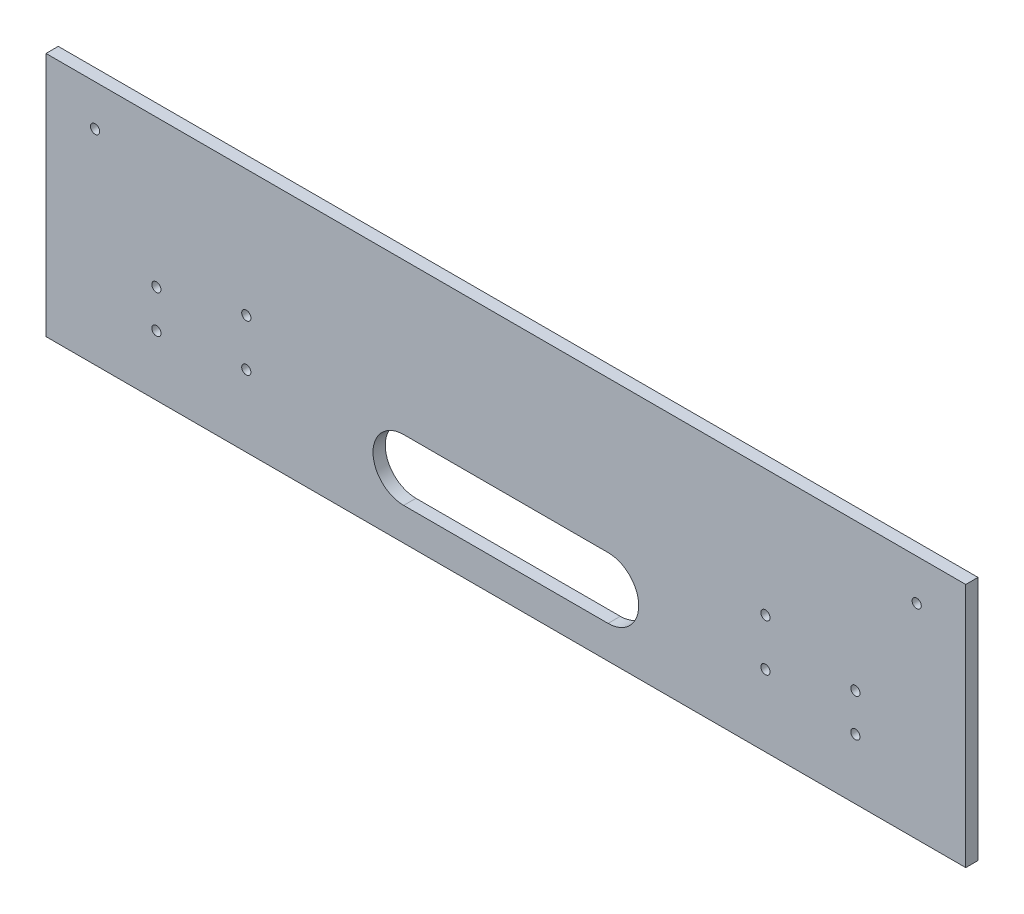
ISO-10303-21;
HEADER;
FILE_DESCRIPTION(('STEP AP214'),'2;1');
FILE_NAME('part.step','',(''),(''),'','','');
FILE_SCHEMA(('AUTOMOTIVE_DESIGN { 1 0 10303 214 1 1 1 1 }'));
ENDSEC;
DATA;
#1=APPLICATION_CONTEXT('core data for automotive mechanical design processes');
#2=APPLICATION_PROTOCOL_DEFINITION('international standard','automotive_design',2000,#1);
#3=PRODUCT_CONTEXT('',#1,'mechanical');
#4=PRODUCT('Part','Part','',(#3));
#5=PRODUCT_RELATED_PRODUCT_CATEGORY('part','',(#4));
#6=PRODUCT_DEFINITION_FORMATION('','',#4);
#7=PRODUCT_DEFINITION_CONTEXT('part definition',#1,'design');
#8=PRODUCT_DEFINITION('design','',#6,#7);
#9=PRODUCT_DEFINITION_SHAPE('','',#8);
#10=(LENGTH_UNIT() NAMED_UNIT(*) SI_UNIT(.MILLI.,.METRE.));
#11=(NAMED_UNIT(*) PLANE_ANGLE_UNIT() SI_UNIT($,.RADIAN.));
#12=(NAMED_UNIT(*) SI_UNIT($,.STERADIAN.) SOLID_ANGLE_UNIT());
#13=UNCERTAINTY_MEASURE_WITH_UNIT(LENGTH_MEASURE(1.E-05),#10,'distance_accuracy_value','');
#14=(GEOMETRIC_REPRESENTATION_CONTEXT(3) GLOBAL_UNCERTAINTY_ASSIGNED_CONTEXT((#13)) GLOBAL_UNIT_ASSIGNED_CONTEXT((#10,
#11,#12)) REPRESENTATION_CONTEXT('',''));
#15=CARTESIAN_POINT('',(0.,0.,0.));
#16=DIRECTION('',(0.,0.,1.));
#17=DIRECTION('',(1.,0.,0.));
#18=AXIS2_PLACEMENT_3D('',#15,#16,#17);
#19=CARTESIAN_POINT('',(-225.,60.,6.));
#20=DIRECTION('',(1.,0.,0.));
#21=DIRECTION('',(0.,0.,-1.));
#22=AXIS2_PLACEMENT_3D('',#19,#20,#21);
#23=PLANE('',#22);
#24=DIRECTION('',(0.,-1.,0.));
#25=VECTOR('',#24,1.);
#26=CARTESIAN_POINT('',(-225.,60.,0.));
#27=LINE('',#26,#25);
#28=CARTESIAN_POINT('',(-225.,60.,0.));
#29=VERTEX_POINT('',#28);
#30=CARTESIAN_POINT('',(-225.,-60.,0.));
#31=VERTEX_POINT('',#30);
#32=EDGE_CURVE('E127',#29,#31,#27,.T.);
#33=ORIENTED_EDGE('',*,*,#32,.T.);
#34=DIRECTION('',(0.,0.,-1.));
#35=VECTOR('',#34,1.);
#36=CARTESIAN_POINT('',(-225.,-60.,6.));
#37=LINE('',#36,#35);
#38=CARTESIAN_POINT('',(-225.,-60.,6.));
#39=VERTEX_POINT('',#38);
#40=EDGE_CURVE('E156',#39,#31,#37,.T.);
#41=ORIENTED_EDGE('',*,*,#40,.F.);
#42=DIRECTION('',(0.,-1.,0.));
#43=VECTOR('',#42,1.);
#44=CARTESIAN_POINT('',(-225.,60.,6.));
#45=LINE('',#44,#43);
#46=CARTESIAN_POINT('',(-225.,60.,6.));
#47=VERTEX_POINT('',#46);
#48=EDGE_CURVE('E130',#47,#39,#45,.T.);
#49=ORIENTED_EDGE('',*,*,#48,.F.);
#50=DIRECTION('',(0.,0.,-1.));
#51=VECTOR('',#50,1.);
#52=CARTESIAN_POINT('',(-225.,60.,6.));
#53=LINE('',#52,#51);
#54=EDGE_CURVE('E140',#47,#29,#53,.T.);
#55=ORIENTED_EDGE('',*,*,#54,.T.);
#56=EDGE_LOOP('',(#33,#41,#49,#55));
#57=FACE_BOUND('',#56,.T.);
#58=ADVANCED_FACE('F37',(#57),#23,.F.);
#59=CARTESIAN_POINT('',(-225.,-60.,6.));
#60=DIRECTION('',(0.,1.,0.));
#61=DIRECTION('',(0.,0.,1.));
#62=AXIS2_PLACEMENT_3D('',#59,#60,#61);
#63=PLANE('',#62);
#64=DIRECTION('',(1.,0.,0.));
#65=VECTOR('',#64,1.);
#66=CARTESIAN_POINT('',(-225.,-60.,0.));
#67=LINE('',#66,#65);
#68=CARTESIAN_POINT('',(225.,-60.,0.));
#69=VERTEX_POINT('',#68);
#70=EDGE_CURVE('E143',#31,#69,#67,.T.);
#71=ORIENTED_EDGE('',*,*,#70,.T.);
#72=DIRECTION('',(0.,0.,-1.));
#73=VECTOR('',#72,1.);
#74=CARTESIAN_POINT('',(225.,-60.,6.));
#75=LINE('',#74,#73);
#76=CARTESIAN_POINT('',(225.,-60.,6.));
#77=VERTEX_POINT('',#76);
#78=EDGE_CURVE('E153',#77,#69,#75,.T.);
#79=ORIENTED_EDGE('',*,*,#78,.F.);
#80=DIRECTION('',(1.,0.,0.));
#81=VECTOR('',#80,1.);
#82=CARTESIAN_POINT('',(-225.,-60.,6.));
#83=LINE('',#82,#81);
#84=EDGE_CURVE('E133',#39,#77,#83,.T.);
#85=ORIENTED_EDGE('',*,*,#84,.F.);
#86=ORIENTED_EDGE('',*,*,#40,.T.);
#87=EDGE_LOOP('',(#71,#79,#85,#86));
#88=FACE_BOUND('',#87,.T.);
#89=ADVANCED_FACE('F181',(#88),#63,.F.);
#90=CARTESIAN_POINT('',(225.,60.,6.));
#91=DIRECTION('',(-1.,0.,0.));
#92=DIRECTION('',(0.,0.,1.));
#93=AXIS2_PLACEMENT_3D('',#90,#91,#92);
#94=PLANE('',#93);
#95=DIRECTION('',(0.,1.,0.));
#96=VECTOR('',#95,1.);
#97=CARTESIAN_POINT('',(225.,60.,0.));
#98=LINE('',#97,#96);
#99=CARTESIAN_POINT('',(225.,60.,0.));
#100=VERTEX_POINT('',#99);
#101=EDGE_CURVE('E145',#69,#100,#98,.T.);
#102=ORIENTED_EDGE('',*,*,#101,.T.);
#103=DIRECTION('',(0.,0.,-1.));
#104=VECTOR('',#103,1.);
#105=CARTESIAN_POINT('',(225.,60.,6.));
#106=LINE('',#105,#104);
#107=CARTESIAN_POINT('',(225.,60.,6.));
#108=VERTEX_POINT('',#107);
#109=EDGE_CURVE('E150',#108,#100,#106,.T.);
#110=ORIENTED_EDGE('',*,*,#109,.F.);
#111=DIRECTION('',(0.,1.,0.));
#112=VECTOR('',#111,1.);
#113=CARTESIAN_POINT('',(225.,60.,6.));
#114=LINE('',#113,#112);
#115=EDGE_CURVE('E136',#77,#108,#114,.T.);
#116=ORIENTED_EDGE('',*,*,#115,.F.);
#117=ORIENTED_EDGE('',*,*,#78,.T.);
#118=EDGE_LOOP('',(#102,#110,#116,#117));
#119=FACE_BOUND('',#118,.T.);
#120=ADVANCED_FACE('F186',(#119),#94,.F.);
#121=CARTESIAN_POINT('',(-225.,60.,6.));
#122=DIRECTION('',(0.,-1.,0.));
#123=DIRECTION('',(0.,0.,-1.));
#124=AXIS2_PLACEMENT_3D('',#121,#122,#123);
#125=PLANE('',#124);
#126=DIRECTION('',(-1.,0.,0.));
#127=VECTOR('',#126,1.);
#128=CARTESIAN_POINT('',(-225.,60.,0.));
#129=LINE('',#128,#127);
#130=EDGE_CURVE('E134',#100,#29,#129,.T.);
#131=ORIENTED_EDGE('',*,*,#130,.T.);
#132=ORIENTED_EDGE('',*,*,#54,.F.);
#133=DIRECTION('',(-1.,0.,0.));
#134=VECTOR('',#133,1.);
#135=CARTESIAN_POINT('',(-225.,60.,6.));
#136=LINE('',#135,#134);
#137=EDGE_CURVE('E138',#108,#47,#136,.T.);
#138=ORIENTED_EDGE('',*,*,#137,.F.);
#139=ORIENTED_EDGE('',*,*,#109,.T.);
#140=EDGE_LOOP('',(#131,#132,#138,#139));
#141=FACE_BOUND('',#140,.T.);
#142=ADVANCED_FACE('F199',(#141),#125,.F.);
#143=CARTESIAN_POINT('',(0.,0.,6.));
#144=DIRECTION('',(0.,0.,1.));
#145=DIRECTION('',(1.,0.,0.));
#146=AXIS2_PLACEMENT_3D('',#143,#144,#145);
#147=PLANE('',#146);
#148=CARTESIAN_POINT('',(201.,40.,6.));
#149=DIRECTION('',(0.,0.,1.));
#150=DIRECTION('',(1.,0.,0.));
#151=AXIS2_PLACEMENT_3D('',#148,#149,#150);
#152=CIRCLE('',#151,2.25000000000001);
#153=CARTESIAN_POINT('',(203.25,40.,6.));
#154=VERTEX_POINT('',#153);
#155=EDGE_CURVE('E214',#154,#154,#152,.T.);
#156=ORIENTED_EDGE('',*,*,#155,.F.);
#157=EDGE_LOOP('',(#156));
#158=FACE_BOUND('',#157,.T.);
#159=CARTESIAN_POINT('',(127.,-1.99999999999999,6.));
#160=DIRECTION('',(0.,0.,1.));
#161=DIRECTION('',(1.,0.,0.));
#162=AXIS2_PLACEMENT_3D('',#159,#160,#161);
#163=CIRCLE('',#162,2.25);
#164=CARTESIAN_POINT('',(129.25,-1.99999999999999,6.));
#165=VERTEX_POINT('',#164);
#166=EDGE_CURVE('E218',#165,#165,#163,.T.);
#167=ORIENTED_EDGE('',*,*,#166,.F.);
#168=EDGE_LOOP('',(#167));
#169=FACE_BOUND('',#168,.T.);
#170=CARTESIAN_POINT('',(127.,-25.,6.));
#171=DIRECTION('',(0.,0.,1.));
#172=DIRECTION('',(1.,0.,0.));
#173=AXIS2_PLACEMENT_3D('',#170,#171,#172);
#174=CIRCLE('',#173,2.25);
#175=CARTESIAN_POINT('',(129.25,-25.,6.));
#176=VERTEX_POINT('',#175);
#177=EDGE_CURVE('E222',#176,#176,#174,.T.);
#178=ORIENTED_EDGE('',*,*,#177,.F.);
#179=EDGE_LOOP('',(#178));
#180=FACE_BOUND('',#179,.T.);
#181=CARTESIAN_POINT('',(-127.,-1.99999999999999,6.));
#182=DIRECTION('',(0.,0.,1.));
#183=DIRECTION('',(1.,0.,0.));
#184=AXIS2_PLACEMENT_3D('',#181,#182,#183);
#185=CIRCLE('',#184,2.25000000000001);
#186=CARTESIAN_POINT('',(-124.75,-1.99999999999999,6.));
#187=VERTEX_POINT('',#186);
#188=EDGE_CURVE('E226',#187,#187,#185,.T.);
#189=ORIENTED_EDGE('',*,*,#188,.F.);
#190=EDGE_LOOP('',(#189));
#191=FACE_BOUND('',#190,.T.);
#192=CARTESIAN_POINT('',(171.,-30.5,6.));
#193=DIRECTION('',(0.,0.,1.));
#194=DIRECTION('',(1.,0.,0.));
#195=AXIS2_PLACEMENT_3D('',#192,#193,#194);
#196=CIRCLE('',#195,2.25000000000001);
#197=CARTESIAN_POINT('',(173.25,-30.5,6.));
#198=VERTEX_POINT('',#197);
#199=EDGE_CURVE('E230',#198,#198,#196,.T.);
#200=ORIENTED_EDGE('',*,*,#199,.F.);
#201=EDGE_LOOP('',(#200));
#202=FACE_BOUND('',#201,.T.);
#203=CARTESIAN_POINT('',(-171.,-12.,6.));
#204=DIRECTION('',(0.,0.,1.));
#205=DIRECTION('',(1.,0.,0.));
#206=AXIS2_PLACEMENT_3D('',#203,#204,#205);
#207=CIRCLE('',#206,2.25000000000001);
#208=CARTESIAN_POINT('',(-168.75,-12.,6.));
#209=VERTEX_POINT('',#208);
#210=EDGE_CURVE('E234',#209,#209,#207,.T.);
#211=ORIENTED_EDGE('',*,*,#210,.F.);
#212=EDGE_LOOP('',(#211));
#213=FACE_BOUND('',#212,.T.);
#214=CARTESIAN_POINT('',(-171.,-30.5,6.));
#215=DIRECTION('',(0.,0.,1.));
#216=DIRECTION('',(1.,0.,0.));
#217=AXIS2_PLACEMENT_3D('',#214,#215,#216);
#218=CIRCLE('',#217,2.25000000000001);
#219=CARTESIAN_POINT('',(-168.75,-30.5,6.));
#220=VERTEX_POINT('',#219);
#221=EDGE_CURVE('E238',#220,#220,#218,.T.);
#222=ORIENTED_EDGE('',*,*,#221,.F.);
#223=EDGE_LOOP('',(#222));
#224=FACE_BOUND('',#223,.T.);
#225=CARTESIAN_POINT('',(-201.,40.0000000000001,6.));
#226=DIRECTION('',(0.,0.,1.));
#227=DIRECTION('',(1.,0.,0.));
#228=AXIS2_PLACEMENT_3D('',#225,#226,#227);
#229=CIRCLE('',#228,2.25000000000001);
#230=CARTESIAN_POINT('',(-198.75,40.0000000000001,6.));
#231=VERTEX_POINT('',#230);
#232=EDGE_CURVE('E242',#231,#231,#229,.T.);
#233=ORIENTED_EDGE('',*,*,#232,.F.);
#234=EDGE_LOOP('',(#233));
#235=FACE_BOUND('',#234,.T.);
#236=CARTESIAN_POINT('',(-127.,-25.,6.));
#237=DIRECTION('',(0.,0.,1.));
#238=DIRECTION('',(1.,0.,0.));
#239=AXIS2_PLACEMENT_3D('',#236,#237,#238);
#240=CIRCLE('',#239,2.25000000000001);
#241=CARTESIAN_POINT('',(-124.75,-25.,6.));
#242=VERTEX_POINT('',#241);
#243=EDGE_CURVE('E246',#242,#242,#240,.T.);
#244=ORIENTED_EDGE('',*,*,#243,.F.);
#245=EDGE_LOOP('',(#244));
#246=FACE_BOUND('',#245,.T.);
#247=CARTESIAN_POINT('',(171.,-12.,6.));
#248=DIRECTION('',(0.,0.,1.));
#249=DIRECTION('',(1.,0.,0.));
#250=AXIS2_PLACEMENT_3D('',#247,#248,#249);
#251=CIRCLE('',#250,2.25000000000001);
#252=CARTESIAN_POINT('',(173.25,-12.,6.));
#253=VERTEX_POINT('',#252);
#254=EDGE_CURVE('E249',#253,#253,#251,.T.);
#255=ORIENTED_EDGE('',*,*,#254,.F.);
#256=EDGE_LOOP('',(#255));
#257=FACE_BOUND('',#256,.T.);
#258=CARTESIAN_POINT('',(-50.,-29.,6.));
#259=DIRECTION('',(0.,0.,1.));
#260=DIRECTION('',(1.,0.,0.));
#261=AXIS2_PLACEMENT_3D('',#258,#259,#260);
#262=CIRCLE('',#261,15.);
#263=CARTESIAN_POINT('',(-50.,-14.,6.));
#264=VERTEX_POINT('',#263);
#265=CARTESIAN_POINT('',(-50.,-44.,6.));
#266=VERTEX_POINT('',#265);
#267=EDGE_CURVE('E51',#264,#266,#262,.T.);
#268=ORIENTED_EDGE('',*,*,#267,.F.);
#269=DIRECTION('',(-1.,0.,0.));
#270=VECTOR('',#269,1.);
#271=CARTESIAN_POINT('',(-50.,-14.,6.));
#272=LINE('',#271,#270);
#273=CARTESIAN_POINT('',(50.,-14.,6.));
#274=VERTEX_POINT('',#273);
#275=EDGE_CURVE('E120',#274,#264,#272,.T.);
#276=ORIENTED_EDGE('',*,*,#275,.F.);
#277=CARTESIAN_POINT('',(50.,-29.,6.));
#278=DIRECTION('',(0.,0.,1.));
#279=DIRECTION('',(1.,0.,0.));
#280=AXIS2_PLACEMENT_3D('',#277,#278,#279);
#281=CIRCLE('',#280,15.);
#282=CARTESIAN_POINT('',(50.,-44.,6.));
#283=VERTEX_POINT('',#282);
#284=EDGE_CURVE('E104',#283,#274,#281,.T.);
#285=ORIENTED_EDGE('',*,*,#284,.F.);
#286=DIRECTION('',(1.,0.,0.));
#287=VECTOR('',#286,1.);
#288=CARTESIAN_POINT('',(-50.,-44.,6.));
#289=LINE('',#288,#287);
#290=EDGE_CURVE('E113',#266,#283,#289,.T.);
#291=ORIENTED_EDGE('',*,*,#290,.F.);
#292=EDGE_LOOP('',(#268,#276,#285,#291));
#293=FACE_BOUND('',#292,.T.);
#294=ORIENTED_EDGE('',*,*,#48,.T.);
#295=ORIENTED_EDGE('',*,*,#84,.T.);
#296=ORIENTED_EDGE('',*,*,#115,.T.);
#297=ORIENTED_EDGE('',*,*,#137,.T.);
#298=EDGE_LOOP('',(#294,#295,#296,#297));
#299=FACE_BOUND('',#298,.T.);
#300=ADVANCED_FACE('F117',(#158,#169,#180,#191,#202,#213,#224,#235,#246,#257,#293,#299),#147,.T.);
#301=CARTESIAN_POINT('',(0.,0.,0.));
#302=DIRECTION('',(0.,0.,1.));
#303=DIRECTION('',(1.,0.,0.));
#304=AXIS2_PLACEMENT_3D('',#301,#302,#303);
#305=PLANE('',#304);
#306=CARTESIAN_POINT('',(201.,40.,0.));
#307=DIRECTION('',(0.,0.,-1.));
#308=DIRECTION('',(-1.,0.,0.));
#309=AXIS2_PLACEMENT_3D('',#306,#307,#308);
#310=CIRCLE('',#309,2.25000000000001);
#311=CARTESIAN_POINT('',(198.75,40.,0.));
#312=VERTEX_POINT('',#311);
#313=EDGE_CURVE('E274',#312,#312,#310,.T.);
#314=ORIENTED_EDGE('',*,*,#313,.F.);
#315=EDGE_LOOP('',(#314));
#316=FACE_BOUND('',#315,.T.);
#317=CARTESIAN_POINT('',(127.,-1.99999999999999,0.));
#318=DIRECTION('',(0.,0.,-1.));
#319=DIRECTION('',(-1.,0.,0.));
#320=AXIS2_PLACEMENT_3D('',#317,#318,#319);
#321=CIRCLE('',#320,2.25);
#322=CARTESIAN_POINT('',(124.75,-1.99999999999999,0.));
#323=VERTEX_POINT('',#322);
#324=EDGE_CURVE('E276',#323,#323,#321,.T.);
#325=ORIENTED_EDGE('',*,*,#324,.F.);
#326=EDGE_LOOP('',(#325));
#327=FACE_BOUND('',#326,.T.);
#328=CARTESIAN_POINT('',(127.,-25.,0.));
#329=DIRECTION('',(0.,0.,-1.));
#330=DIRECTION('',(-1.,0.,0.));
#331=AXIS2_PLACEMENT_3D('',#328,#329,#330);
#332=CIRCLE('',#331,2.25);
#333=CARTESIAN_POINT('',(124.75,-25.,0.));
#334=VERTEX_POINT('',#333);
#335=EDGE_CURVE('E282',#334,#334,#332,.T.);
#336=ORIENTED_EDGE('',*,*,#335,.F.);
#337=EDGE_LOOP('',(#336));
#338=FACE_BOUND('',#337,.T.);
#339=CARTESIAN_POINT('',(-127.,-1.99999999999999,0.));
#340=DIRECTION('',(0.,0.,-1.));
#341=DIRECTION('',(-1.,0.,0.));
#342=AXIS2_PLACEMENT_3D('',#339,#340,#341);
#343=CIRCLE('',#342,2.25000000000001);
#344=CARTESIAN_POINT('',(-129.25,-1.99999999999999,0.));
#345=VERTEX_POINT('',#344);
#346=EDGE_CURVE('E285',#345,#345,#343,.T.);
#347=ORIENTED_EDGE('',*,*,#346,.F.);
#348=EDGE_LOOP('',(#347));
#349=FACE_BOUND('',#348,.T.);
#350=CARTESIAN_POINT('',(171.,-30.5,0.));
#351=DIRECTION('',(0.,0.,-1.));
#352=DIRECTION('',(-1.,0.,0.));
#353=AXIS2_PLACEMENT_3D('',#350,#351,#352);
#354=CIRCLE('',#353,2.25000000000001);
#355=CARTESIAN_POINT('',(168.75,-30.5,0.));
#356=VERTEX_POINT('',#355);
#357=EDGE_CURVE('E255',#356,#356,#354,.T.);
#358=ORIENTED_EDGE('',*,*,#357,.F.);
#359=EDGE_LOOP('',(#358));
#360=FACE_BOUND('',#359,.T.);
#361=CARTESIAN_POINT('',(-171.,-12.,0.));
#362=DIRECTION('',(0.,0.,-1.));
#363=DIRECTION('',(-1.,0.,0.));
#364=AXIS2_PLACEMENT_3D('',#361,#362,#363);
#365=CIRCLE('',#364,2.25000000000001);
#366=CARTESIAN_POINT('',(-173.25,-12.,0.));
#367=VERTEX_POINT('',#366);
#368=EDGE_CURVE('E289',#367,#367,#365,.T.);
#369=ORIENTED_EDGE('',*,*,#368,.F.);
#370=EDGE_LOOP('',(#369));
#371=FACE_BOUND('',#370,.T.);
#372=CARTESIAN_POINT('',(-171.,-30.5,0.));
#373=DIRECTION('',(0.,0.,-1.));
#374=DIRECTION('',(-1.,0.,0.));
#375=AXIS2_PLACEMENT_3D('',#372,#373,#374);
#376=CIRCLE('',#375,2.25000000000001);
#377=CARTESIAN_POINT('',(-173.25,-30.5,0.));
#378=VERTEX_POINT('',#377);
#379=EDGE_CURVE('E279',#378,#378,#376,.T.);
#380=ORIENTED_EDGE('',*,*,#379,.F.);
#381=EDGE_LOOP('',(#380));
#382=FACE_BOUND('',#381,.T.);
#383=CARTESIAN_POINT('',(-201.,40.0000000000001,0.));
#384=DIRECTION('',(0.,0.,-1.));
#385=DIRECTION('',(-1.,0.,0.));
#386=AXIS2_PLACEMENT_3D('',#383,#384,#385);
#387=CIRCLE('',#386,2.25000000000001);
#388=CARTESIAN_POINT('',(-203.25,40.0000000000001,0.));
#389=VERTEX_POINT('',#388);
#390=EDGE_CURVE('E275',#389,#389,#387,.T.);
#391=ORIENTED_EDGE('',*,*,#390,.F.);
#392=EDGE_LOOP('',(#391));
#393=FACE_BOUND('',#392,.T.);
#394=CARTESIAN_POINT('',(-127.,-25.,0.));
#395=DIRECTION('',(0.,0.,-1.));
#396=DIRECTION('',(-1.,0.,0.));
#397=AXIS2_PLACEMENT_3D('',#394,#395,#396);
#398=CIRCLE('',#397,2.25000000000001);
#399=CARTESIAN_POINT('',(-129.25,-25.,0.));
#400=VERTEX_POINT('',#399);
#401=EDGE_CURVE('E305',#400,#400,#398,.T.);
#402=ORIENTED_EDGE('',*,*,#401,.F.);
#403=EDGE_LOOP('',(#402));
#404=FACE_BOUND('',#403,.T.);
#405=CARTESIAN_POINT('',(171.,-12.,0.));
#406=DIRECTION('',(0.,0.,-1.));
#407=DIRECTION('',(-1.,0.,0.));
#408=AXIS2_PLACEMENT_3D('',#405,#406,#407);
#409=CIRCLE('',#408,2.25000000000001);
#410=CARTESIAN_POINT('',(168.75,-12.,0.));
#411=VERTEX_POINT('',#410);
#412=EDGE_CURVE('E251',#411,#411,#409,.T.);
#413=ORIENTED_EDGE('',*,*,#412,.F.);
#414=EDGE_LOOP('',(#413));
#415=FACE_BOUND('',#414,.T.);
#416=DIRECTION('',(-1.,0.,0.));
#417=VECTOR('',#416,1.);
#418=CARTESIAN_POINT('',(0.,-14.,0.));
#419=LINE('',#418,#417);
#420=CARTESIAN_POINT('',(50.,-14.,0.));
#421=VERTEX_POINT('',#420);
#422=CARTESIAN_POINT('',(-50.,-14.,0.));
#423=VERTEX_POINT('',#422);
#424=EDGE_CURVE('E44',#421,#423,#419,.T.);
#425=ORIENTED_EDGE('',*,*,#424,.T.);
#426=CARTESIAN_POINT('',(-50.,-29.,0.));
#427=DIRECTION('',(0.,0.,1.));
#428=DIRECTION('',(1.,0.,0.));
#429=AXIS2_PLACEMENT_3D('',#426,#427,#428);
#430=CIRCLE('',#429,15.);
#431=CARTESIAN_POINT('',(-50.,-44.,0.));
#432=VERTEX_POINT('',#431);
#433=EDGE_CURVE('E11',#423,#432,#430,.T.);
#434=ORIENTED_EDGE('',*,*,#433,.T.);
#435=DIRECTION('',(1.,0.,0.));
#436=VECTOR('',#435,1.);
#437=CARTESIAN_POINT('',(0.,-44.,0.));
#438=LINE('',#437,#436);
#439=CARTESIAN_POINT('',(50.,-44.,0.));
#440=VERTEX_POINT('',#439);
#441=EDGE_CURVE('E159',#432,#440,#438,.T.);
#442=ORIENTED_EDGE('',*,*,#441,.T.);
#443=CARTESIAN_POINT('',(50.,-29.,0.));
#444=DIRECTION('',(0.,0.,1.));
#445=DIRECTION('',(1.,0.,0.));
#446=AXIS2_PLACEMENT_3D('',#443,#444,#445);
#447=CIRCLE('',#446,15.);
#448=EDGE_CURVE('E107',#440,#421,#447,.T.);
#449=ORIENTED_EDGE('',*,*,#448,.T.);
#450=EDGE_LOOP('',(#425,#434,#442,#449));
#451=FACE_BOUND('',#450,.T.);
#452=ORIENTED_EDGE('',*,*,#32,.F.);
#453=ORIENTED_EDGE('',*,*,#130,.F.);
#454=ORIENTED_EDGE('',*,*,#101,.F.);
#455=ORIENTED_EDGE('',*,*,#70,.F.);
#456=EDGE_LOOP('',(#452,#453,#454,#455));
#457=FACE_BOUND('',#456,.T.);
#458=ADVANCED_FACE('F163',(#316,#327,#338,#349,#360,#371,#382,#393,#404,#415,#451,#457),#305,.F.);
#459=CARTESIAN_POINT('',(-50.,-29.,-4.));
#460=DIRECTION('',(0.,0.,1.));
#461=DIRECTION('',(1.,0.,0.));
#462=AXIS2_PLACEMENT_3D('',#459,#460,#461);
#463=CYLINDRICAL_SURFACE('',#462,15.);
#464=DIRECTION('',(0.,0.,1.));
#465=VECTOR('',#464,1.);
#466=CARTESIAN_POINT('',(-50.,-14.,-4.));
#467=LINE('',#466,#465);
#468=EDGE_CURVE('E125',#423,#264,#467,.T.);
#469=ORIENTED_EDGE('',*,*,#468,.T.);
#470=ORIENTED_EDGE('',*,*,#267,.T.);
#471=DIRECTION('',(0.,0.,1.));
#472=VECTOR('',#471,1.);
#473=CARTESIAN_POINT('',(-50.,-44.,-4.));
#474=LINE('',#473,#472);
#475=EDGE_CURVE('E110',#432,#266,#474,.T.);
#476=ORIENTED_EDGE('',*,*,#475,.F.);
#477=ORIENTED_EDGE('',*,*,#433,.F.);
#478=EDGE_LOOP('',(#469,#470,#476,#477));
#479=FACE_BOUND('',#478,.T.);
#480=ADVANCED_FACE('F168',(#479),#463,.F.);
#481=CARTESIAN_POINT('',(-50.,-14.,-4.));
#482=DIRECTION('',(0.,1.,0.));
#483=DIRECTION('',(-1.,0.,0.));
#484=AXIS2_PLACEMENT_3D('',#481,#482,#483);
#485=PLANE('',#484);
#486=DIRECTION('',(0.,0.,1.));
#487=VECTOR('',#486,1.);
#488=CARTESIAN_POINT('',(50.,-14.,-4.));
#489=LINE('',#488,#487);
#490=EDGE_CURVE('E109',#421,#274,#489,.T.);
#491=ORIENTED_EDGE('',*,*,#490,.T.);
#492=ORIENTED_EDGE('',*,*,#275,.T.);
#493=ORIENTED_EDGE('',*,*,#468,.F.);
#494=ORIENTED_EDGE('',*,*,#424,.F.);
#495=EDGE_LOOP('',(#491,#492,#493,#494));
#496=FACE_BOUND('',#495,.T.);
#497=ADVANCED_FACE('F167',(#496),#485,.F.);
#498=CARTESIAN_POINT('',(50.,-29.,-4.));
#499=DIRECTION('',(0.,0.,1.));
#500=DIRECTION('',(1.,0.,0.));
#501=AXIS2_PLACEMENT_3D('',#498,#499,#500);
#502=CYLINDRICAL_SURFACE('',#501,15.);
#503=DIRECTION('',(0.,0.,1.));
#504=VECTOR('',#503,1.);
#505=CARTESIAN_POINT('',(50.,-44.,-4.));
#506=LINE('',#505,#504);
#507=EDGE_CURVE('E59',#440,#283,#506,.T.);
#508=ORIENTED_EDGE('',*,*,#507,.T.);
#509=ORIENTED_EDGE('',*,*,#284,.T.);
#510=ORIENTED_EDGE('',*,*,#490,.F.);
#511=ORIENTED_EDGE('',*,*,#448,.F.);
#512=EDGE_LOOP('',(#508,#509,#510,#511));
#513=FACE_BOUND('',#512,.T.);
#514=ADVANCED_FACE('F101',(#513),#502,.F.);
#515=CARTESIAN_POINT('',(-50.,-44.,-4.));
#516=DIRECTION('',(0.,-1.,0.));
#517=DIRECTION('',(1.,0.,0.));
#518=AXIS2_PLACEMENT_3D('',#515,#516,#517);
#519=PLANE('',#518);
#520=ORIENTED_EDGE('',*,*,#475,.T.);
#521=ORIENTED_EDGE('',*,*,#290,.T.);
#522=ORIENTED_EDGE('',*,*,#507,.F.);
#523=ORIENTED_EDGE('',*,*,#441,.F.);
#524=EDGE_LOOP('',(#520,#521,#522,#523));
#525=FACE_BOUND('',#524,.T.);
#526=ADVANCED_FACE('F114',(#525),#519,.F.);
#527=CARTESIAN_POINT('',(171.,-12.,10.));
#528=DIRECTION('',(0.,0.,-1.));
#529=DIRECTION('',(-1.,0.,0.));
#530=AXIS2_PLACEMENT_3D('',#527,#528,#529);
#531=CYLINDRICAL_SURFACE('',#530,2.25000000000001);
#532=ORIENTED_EDGE('',*,*,#254,.T.);
#533=EDGE_LOOP('',(#532));
#534=FACE_BOUND('',#533,.T.);
#535=ORIENTED_EDGE('',*,*,#412,.T.);
#536=EDGE_LOOP('',(#535));
#537=FACE_BOUND('',#536,.T.);
#538=ADVANCED_FACE('F308',(#534,#537),#531,.F.);
#539=CARTESIAN_POINT('',(-127.,-25.,10.));
#540=DIRECTION('',(0.,0.,-1.));
#541=DIRECTION('',(-1.,0.,0.));
#542=AXIS2_PLACEMENT_3D('',#539,#540,#541);
#543=CYLINDRICAL_SURFACE('',#542,2.25000000000001);
#544=ORIENTED_EDGE('',*,*,#243,.T.);
#545=EDGE_LOOP('',(#544));
#546=FACE_BOUND('',#545,.T.);
#547=ORIENTED_EDGE('',*,*,#401,.T.);
#548=EDGE_LOOP('',(#547));
#549=FACE_BOUND('',#548,.T.);
#550=ADVANCED_FACE('F310',(#546,#549),#543,.F.);
#551=CARTESIAN_POINT('',(-201.,40.0000000000001,10.));
#552=DIRECTION('',(0.,0.,-1.));
#553=DIRECTION('',(-1.,0.,0.));
#554=AXIS2_PLACEMENT_3D('',#551,#552,#553);
#555=CYLINDRICAL_SURFACE('',#554,2.25000000000001);
#556=ORIENTED_EDGE('',*,*,#232,.T.);
#557=EDGE_LOOP('',(#556));
#558=FACE_BOUND('',#557,.T.);
#559=ORIENTED_EDGE('',*,*,#390,.T.);
#560=EDGE_LOOP('',(#559));
#561=FACE_BOUND('',#560,.T.);
#562=ADVANCED_FACE('F316',(#558,#561),#555,.F.);
#563=CARTESIAN_POINT('',(-171.,-30.5,10.));
#564=DIRECTION('',(0.,0.,-1.));
#565=DIRECTION('',(-1.,0.,0.));
#566=AXIS2_PLACEMENT_3D('',#563,#564,#565);
#567=CYLINDRICAL_SURFACE('',#566,2.25000000000001);
#568=ORIENTED_EDGE('',*,*,#221,.T.);
#569=EDGE_LOOP('',(#568));
#570=FACE_BOUND('',#569,.T.);
#571=ORIENTED_EDGE('',*,*,#379,.T.);
#572=EDGE_LOOP('',(#571));
#573=FACE_BOUND('',#572,.T.);
#574=ADVANCED_FACE('F367',(#570,#573),#567,.F.);
#575=CARTESIAN_POINT('',(-171.,-12.,10.));
#576=DIRECTION('',(0.,0.,-1.));
#577=DIRECTION('',(-1.,0.,0.));
#578=AXIS2_PLACEMENT_3D('',#575,#576,#577);
#579=CYLINDRICAL_SURFACE('',#578,2.25000000000001);
#580=ORIENTED_EDGE('',*,*,#210,.T.);
#581=EDGE_LOOP('',(#580));
#582=FACE_BOUND('',#581,.T.);
#583=ORIENTED_EDGE('',*,*,#368,.T.);
#584=EDGE_LOOP('',(#583));
#585=FACE_BOUND('',#584,.T.);
#586=ADVANCED_FACE('F295',(#582,#585),#579,.F.);
#587=CARTESIAN_POINT('',(171.,-30.5,10.));
#588=DIRECTION('',(0.,0.,-1.));
#589=DIRECTION('',(-1.,0.,0.));
#590=AXIS2_PLACEMENT_3D('',#587,#588,#589);
#591=CYLINDRICAL_SURFACE('',#590,2.25000000000001);
#592=ORIENTED_EDGE('',*,*,#199,.T.);
#593=EDGE_LOOP('',(#592));
#594=FACE_BOUND('',#593,.T.);
#595=ORIENTED_EDGE('',*,*,#357,.T.);
#596=EDGE_LOOP('',(#595));
#597=FACE_BOUND('',#596,.T.);
#598=ADVANCED_FACE('F388',(#594,#597),#591,.F.);
#599=CARTESIAN_POINT('',(-127.,-1.99999999999999,10.));
#600=DIRECTION('',(0.,0.,-1.));
#601=DIRECTION('',(-1.,0.,0.));
#602=AXIS2_PLACEMENT_3D('',#599,#600,#601);
#603=CYLINDRICAL_SURFACE('',#602,2.25000000000001);
#604=ORIENTED_EDGE('',*,*,#188,.T.);
#605=EDGE_LOOP('',(#604));
#606=FACE_BOUND('',#605,.T.);
#607=ORIENTED_EDGE('',*,*,#346,.T.);
#608=EDGE_LOOP('',(#607));
#609=FACE_BOUND('',#608,.T.);
#610=ADVANCED_FACE('F398',(#606,#609),#603,.F.);
#611=CARTESIAN_POINT('',(127.,-25.,10.));
#612=DIRECTION('',(0.,0.,-1.));
#613=DIRECTION('',(-1.,0.,0.));
#614=AXIS2_PLACEMENT_3D('',#611,#612,#613);
#615=CYLINDRICAL_SURFACE('',#614,2.25);
#616=ORIENTED_EDGE('',*,*,#177,.T.);
#617=EDGE_LOOP('',(#616));
#618=FACE_BOUND('',#617,.T.);
#619=ORIENTED_EDGE('',*,*,#335,.T.);
#620=EDGE_LOOP('',(#619));
#621=FACE_BOUND('',#620,.T.);
#622=ADVANCED_FACE('F408',(#618,#621),#615,.F.);
#623=CARTESIAN_POINT('',(127.,-1.99999999999999,10.));
#624=DIRECTION('',(0.,0.,-1.));
#625=DIRECTION('',(-1.,0.,0.));
#626=AXIS2_PLACEMENT_3D('',#623,#624,#625);
#627=CYLINDRICAL_SURFACE('',#626,2.25);
#628=ORIENTED_EDGE('',*,*,#166,.T.);
#629=EDGE_LOOP('',(#628));
#630=FACE_BOUND('',#629,.T.);
#631=ORIENTED_EDGE('',*,*,#324,.T.);
#632=EDGE_LOOP('',(#631));
#633=FACE_BOUND('',#632,.T.);
#634=ADVANCED_FACE('F270',(#630,#633),#627,.F.);
#635=CARTESIAN_POINT('',(201.,40.,10.));
#636=DIRECTION('',(0.,0.,-1.));
#637=DIRECTION('',(-1.,0.,0.));
#638=AXIS2_PLACEMENT_3D('',#635,#636,#637);
#639=CYLINDRICAL_SURFACE('',#638,2.25000000000001);
#640=ORIENTED_EDGE('',*,*,#155,.T.);
#641=EDGE_LOOP('',(#640));
#642=FACE_BOUND('',#641,.T.);
#643=ORIENTED_EDGE('',*,*,#313,.T.);
#644=EDGE_LOOP('',(#643));
#645=FACE_BOUND('',#644,.T.);
#646=ADVANCED_FACE('F267',(#642,#645),#639,.F.);
#647=CLOSED_SHELL('',(#58,#89,#120,#142,#300,#458,#480,#497,#514,#526,#538,#550,#562,#574,#586,
#598,#610,#622,#634,#646));
#648=MANIFOLD_SOLID_BREP('B2',#647);
#649=ADVANCED_BREP_SHAPE_REPRESENTATION('',(#18,#648),#14);
#650=SHAPE_DEFINITION_REPRESENTATION(#9,#649);
ENDSEC;
END-ISO-10303-21;
